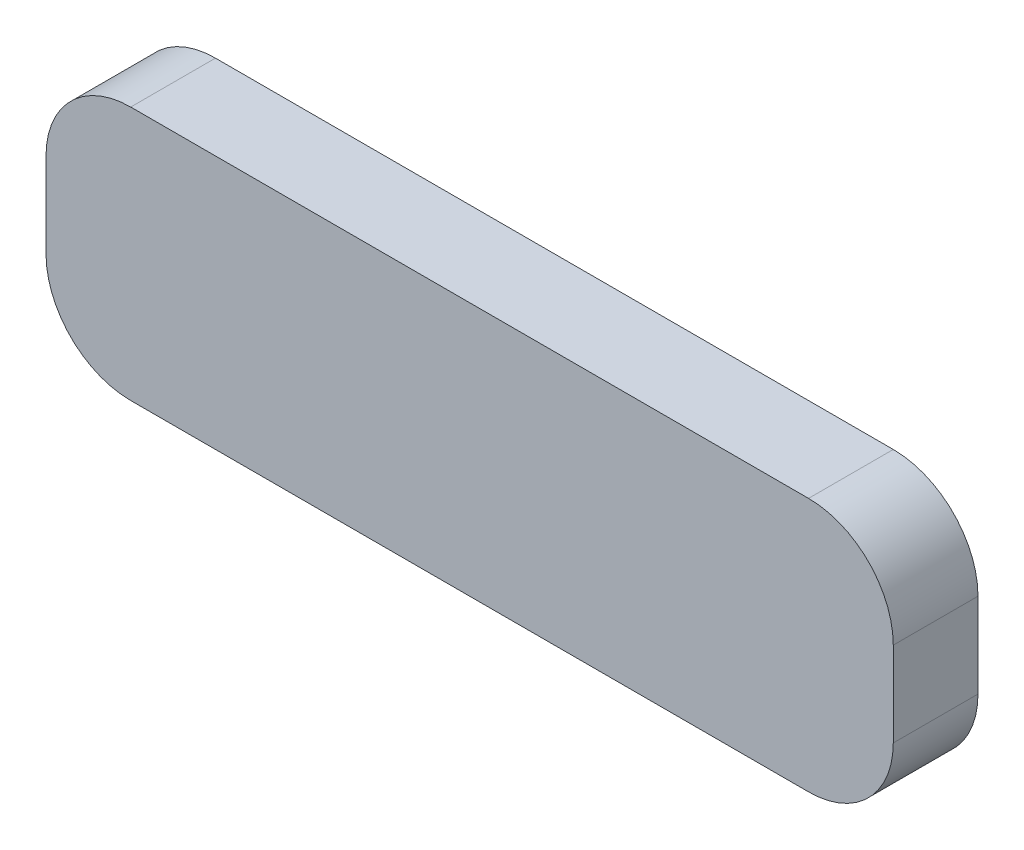
ISO-10303-21;
HEADER;
FILE_DESCRIPTION(('STEP AP214'),'2;1');
FILE_NAME('part.step','',(''),(''),'','','');
FILE_SCHEMA(('AUTOMOTIVE_DESIGN { 1 0 10303 214 1 1 1 1 }'));
ENDSEC;
DATA;
#1=APPLICATION_CONTEXT('core data for automotive mechanical design processes');
#2=APPLICATION_PROTOCOL_DEFINITION('international standard','automotive_design',2000,#1);
#3=PRODUCT_CONTEXT('',#1,'mechanical');
#4=PRODUCT('Part','Part','',(#3));
#5=PRODUCT_RELATED_PRODUCT_CATEGORY('part','',(#4));
#6=PRODUCT_DEFINITION_FORMATION('','',#4);
#7=PRODUCT_DEFINITION_CONTEXT('part definition',#1,'design');
#8=PRODUCT_DEFINITION('design','',#6,#7);
#9=PRODUCT_DEFINITION_SHAPE('','',#8);
#10=(LENGTH_UNIT() NAMED_UNIT(*) SI_UNIT(.MILLI.,.METRE.));
#11=(NAMED_UNIT(*) PLANE_ANGLE_UNIT() SI_UNIT($,.RADIAN.));
#12=(NAMED_UNIT(*) SI_UNIT($,.STERADIAN.) SOLID_ANGLE_UNIT());
#13=UNCERTAINTY_MEASURE_WITH_UNIT(LENGTH_MEASURE(1.E-05),#10,'distance_accuracy_value','');
#14=(GEOMETRIC_REPRESENTATION_CONTEXT(3) GLOBAL_UNCERTAINTY_ASSIGNED_CONTEXT((#13)) GLOBAL_UNIT_ASSIGNED_CONTEXT((#10,
#11,#12)) REPRESENTATION_CONTEXT('',''));
#15=CARTESIAN_POINT('',(0.,0.,0.));
#16=DIRECTION('',(0.,0.,1.));
#17=DIRECTION('',(1.,0.,0.));
#18=AXIS2_PLACEMENT_3D('',#15,#16,#17);
#19=CARTESIAN_POINT('',(10.,20.,10.));
#20=DIRECTION('',(0.,0.,-1.));
#21=DIRECTION('',(-1.,0.,0.));
#22=AXIS2_PLACEMENT_3D('',#19,#20,#21);
#23=CYLINDRICAL_SURFACE('',#22,10.);
#24=CARTESIAN_POINT('',(10.,20.,0.));
#25=DIRECTION('',(0.,0.,-1.));
#26=DIRECTION('',(-1.,0.,0.));
#27=AXIS2_PLACEMENT_3D('',#24,#25,#26);
#28=CIRCLE('',#27,10.);
#29=CARTESIAN_POINT('',(0.,19.9999999999999,0.));
#30=VERTEX_POINT('',#29);
#31=CARTESIAN_POINT('',(10.0000000000001,30.,0.));
#32=VERTEX_POINT('',#31);
#33=EDGE_CURVE('E134',#30,#32,#28,.T.);
#34=ORIENTED_EDGE('',*,*,#33,.F.);
#35=DIRECTION('',(0.,0.,-1.));
#36=VECTOR('',#35,1.);
#37=CARTESIAN_POINT('',(0.,19.9999999999999,10.));
#38=LINE('',#37,#36);
#39=CARTESIAN_POINT('',(0.,19.9999999999999,10.));
#40=VERTEX_POINT('',#39);
#41=EDGE_CURVE('E11',#40,#30,#38,.T.);
#42=ORIENTED_EDGE('',*,*,#41,.F.);
#43=CARTESIAN_POINT('',(10.,20.,10.));
#44=DIRECTION('',(0.,0.,-1.));
#45=DIRECTION('',(-1.,0.,0.));
#46=AXIS2_PLACEMENT_3D('',#43,#44,#45);
#47=CIRCLE('',#46,10.);
#48=CARTESIAN_POINT('',(10.0000000000001,30.,10.));
#49=VERTEX_POINT('',#48);
#50=EDGE_CURVE('E155',#40,#49,#47,.T.);
#51=ORIENTED_EDGE('',*,*,#50,.T.);
#52=DIRECTION('',(0.,0.,-1.));
#53=VECTOR('',#52,1.);
#54=CARTESIAN_POINT('',(10.0000000000001,30.,10.));
#55=LINE('',#54,#53);
#56=EDGE_CURVE('E45',#49,#32,#55,.T.);
#57=ORIENTED_EDGE('',*,*,#56,.T.);
#58=EDGE_LOOP('',(#34,#42,#51,#57));
#59=FACE_BOUND('',#58,.T.);
#60=ADVANCED_FACE('F39',(#59),#23,.T.);
#61=CARTESIAN_POINT('',(0.,10.0000000000001,10.));
#62=DIRECTION('',(-1.,0.,0.));
#63=DIRECTION('',(0.,0.,1.));
#64=AXIS2_PLACEMENT_3D('',#61,#62,#63);
#65=PLANE('',#64);
#66=DIRECTION('',(0.,1.,0.));
#67=VECTOR('',#66,1.);
#68=CARTESIAN_POINT('',(0.,10.0000000000001,0.));
#69=LINE('',#68,#67);
#70=CARTESIAN_POINT('',(0.,10.,0.));
#71=VERTEX_POINT('',#70);
#72=EDGE_CURVE('E147',#71,#30,#69,.T.);
#73=ORIENTED_EDGE('',*,*,#72,.F.);
#74=DIRECTION('',(0.,0.,-1.));
#75=VECTOR('',#74,1.);
#76=CARTESIAN_POINT('',(0.,10.,10.));
#77=LINE('',#76,#75);
#78=CARTESIAN_POINT('',(0.,10.,10.));
#79=VERTEX_POINT('',#78);
#80=EDGE_CURVE('E48',#79,#71,#77,.T.);
#81=ORIENTED_EDGE('',*,*,#80,.F.);
#82=DIRECTION('',(0.,1.,0.));
#83=VECTOR('',#82,1.);
#84=CARTESIAN_POINT('',(0.,10.0000000000001,10.));
#85=LINE('',#84,#83);
#86=EDGE_CURVE('E126',#79,#40,#85,.T.);
#87=ORIENTED_EDGE('',*,*,#86,.T.);
#88=ORIENTED_EDGE('',*,*,#41,.T.);
#89=EDGE_LOOP('',(#73,#81,#87,#88));
#90=FACE_BOUND('',#89,.T.);
#91=ADVANCED_FACE('F164',(#90),#65,.T.);
#92=CARTESIAN_POINT('',(10.,10.,10.));
#93=DIRECTION('',(0.,0.,-1.));
#94=DIRECTION('',(-1.,0.,0.));
#95=AXIS2_PLACEMENT_3D('',#92,#93,#94);
#96=CYLINDRICAL_SURFACE('',#95,10.);
#97=CARTESIAN_POINT('',(10.,10.,0.));
#98=DIRECTION('',(0.,0.,-1.));
#99=DIRECTION('',(-1.,0.,0.));
#100=AXIS2_PLACEMENT_3D('',#97,#98,#99);
#101=CIRCLE('',#100,10.);
#102=CARTESIAN_POINT('',(10.0000000000001,0.,0.));
#103=VERTEX_POINT('',#102);
#104=EDGE_CURVE('E111',#103,#71,#101,.T.);
#105=ORIENTED_EDGE('',*,*,#104,.F.);
#106=DIRECTION('',(0.,0.,-1.));
#107=VECTOR('',#106,1.);
#108=CARTESIAN_POINT('',(10.0000000000001,0.,10.));
#109=LINE('',#108,#107);
#110=CARTESIAN_POINT('',(10.0000000000001,0.,10.));
#111=VERTEX_POINT('',#110);
#112=EDGE_CURVE('E107',#111,#103,#109,.T.);
#113=ORIENTED_EDGE('',*,*,#112,.F.);
#114=CARTESIAN_POINT('',(10.,10.,10.));
#115=DIRECTION('',(0.,0.,-1.));
#116=DIRECTION('',(-1.,0.,0.));
#117=AXIS2_PLACEMENT_3D('',#114,#115,#116);
#118=CIRCLE('',#117,10.);
#119=EDGE_CURVE('E115',#111,#79,#118,.T.);
#120=ORIENTED_EDGE('',*,*,#119,.T.);
#121=ORIENTED_EDGE('',*,*,#80,.T.);
#122=EDGE_LOOP('',(#105,#113,#120,#121));
#123=FACE_BOUND('',#122,.T.);
#124=ADVANCED_FACE('F109',(#123),#96,.T.);
#125=CARTESIAN_POINT('',(10.0000000000001,0.,10.));
#126=DIRECTION('',(0.,1.,0.));
#127=DIRECTION('',(0.,0.,1.));
#128=AXIS2_PLACEMENT_3D('',#125,#126,#127);
#129=PLANE('',#128);
#130=DIRECTION('',(1.,0.,0.));
#131=VECTOR('',#130,1.);
#132=CARTESIAN_POINT('',(10.0000000000001,0.,0.));
#133=LINE('',#132,#131);
#134=CARTESIAN_POINT('',(90.,0.,0.));
#135=VERTEX_POINT('',#134);
#136=EDGE_CURVE('E150',#103,#135,#133,.T.);
#137=ORIENTED_EDGE('',*,*,#136,.T.);
#138=DIRECTION('',(0.,0.,-1.));
#139=VECTOR('',#138,1.);
#140=CARTESIAN_POINT('',(90.,0.,10.));
#141=LINE('',#140,#139);
#142=CARTESIAN_POINT('',(90.,0.,10.));
#143=VERTEX_POINT('',#142);
#144=EDGE_CURVE('E117',#143,#135,#141,.T.);
#145=ORIENTED_EDGE('',*,*,#144,.F.);
#146=DIRECTION('',(1.,0.,0.));
#147=VECTOR('',#146,1.);
#148=CARTESIAN_POINT('',(10.0000000000001,0.,10.));
#149=LINE('',#148,#147);
#150=EDGE_CURVE('E120',#111,#143,#149,.T.);
#151=ORIENTED_EDGE('',*,*,#150,.F.);
#152=ORIENTED_EDGE('',*,*,#112,.T.);
#153=EDGE_LOOP('',(#137,#145,#151,#152));
#154=FACE_BOUND('',#153,.T.);
#155=ADVANCED_FACE('F124',(#154),#129,.F.);
#156=CARTESIAN_POINT('',(90.,10.,10.));
#157=DIRECTION('',(0.,0.,-1.));
#158=DIRECTION('',(-1.,0.,0.));
#159=AXIS2_PLACEMENT_3D('',#156,#157,#158);
#160=CYLINDRICAL_SURFACE('',#159,10.);
#161=CARTESIAN_POINT('',(90.,10.,0.));
#162=DIRECTION('',(0.,0.,1.));
#163=DIRECTION('',(1.,0.,0.));
#164=AXIS2_PLACEMENT_3D('',#161,#162,#163);
#165=CIRCLE('',#164,10.);
#166=CARTESIAN_POINT('',(100.,10.,0.));
#167=VERTEX_POINT('',#166);
#168=EDGE_CURVE('E144',#135,#167,#165,.T.);
#169=ORIENTED_EDGE('',*,*,#168,.T.);
#170=DIRECTION('',(0.,0.,-1.));
#171=VECTOR('',#170,1.);
#172=CARTESIAN_POINT('',(100.,10.,10.));
#173=LINE('',#172,#171);
#174=CARTESIAN_POINT('',(100.,10.,10.));
#175=VERTEX_POINT('',#174);
#176=EDGE_CURVE('E156',#175,#167,#173,.T.);
#177=ORIENTED_EDGE('',*,*,#176,.F.);
#178=CARTESIAN_POINT('',(90.,10.,10.));
#179=DIRECTION('',(0.,0.,1.));
#180=DIRECTION('',(1.,0.,0.));
#181=AXIS2_PLACEMENT_3D('',#178,#179,#180);
#182=CIRCLE('',#181,10.);
#183=EDGE_CURVE('E122',#143,#175,#182,.T.);
#184=ORIENTED_EDGE('',*,*,#183,.F.);
#185=ORIENTED_EDGE('',*,*,#144,.T.);
#186=EDGE_LOOP('',(#169,#177,#184,#185));
#187=FACE_BOUND('',#186,.T.);
#188=ADVANCED_FACE('F180',(#187),#160,.T.);
#189=CARTESIAN_POINT('',(100.,10.,10.));
#190=DIRECTION('',(-1.,0.,0.));
#191=DIRECTION('',(0.,0.,1.));
#192=AXIS2_PLACEMENT_3D('',#189,#190,#191);
#193=PLANE('',#192);
#194=DIRECTION('',(0.,1.,0.));
#195=VECTOR('',#194,1.);
#196=CARTESIAN_POINT('',(100.,10.,0.));
#197=LINE('',#196,#195);
#198=CARTESIAN_POINT('',(100.,20.,0.));
#199=VERTEX_POINT('',#198);
#200=EDGE_CURVE('E142',#167,#199,#197,.T.);
#201=ORIENTED_EDGE('',*,*,#200,.T.);
#202=DIRECTION('',(0.,0.,-1.));
#203=VECTOR('',#202,1.);
#204=CARTESIAN_POINT('',(100.,20.,10.));
#205=LINE('',#204,#203);
#206=CARTESIAN_POINT('',(100.,20.,10.));
#207=VERTEX_POINT('',#206);
#208=EDGE_CURVE('E157',#207,#199,#205,.T.);
#209=ORIENTED_EDGE('',*,*,#208,.F.);
#210=DIRECTION('',(0.,1.,0.));
#211=VECTOR('',#210,1.);
#212=CARTESIAN_POINT('',(100.,10.,10.));
#213=LINE('',#212,#211);
#214=EDGE_CURVE('E260',#175,#207,#213,.T.);
#215=ORIENTED_EDGE('',*,*,#214,.F.);
#216=ORIENTED_EDGE('',*,*,#176,.T.);
#217=EDGE_LOOP('',(#201,#209,#215,#216));
#218=FACE_BOUND('',#217,.T.);
#219=ADVANCED_FACE('F182',(#218),#193,.F.);
#220=CARTESIAN_POINT('',(90.,20.,10.));
#221=DIRECTION('',(0.,0.,-1.));
#222=DIRECTION('',(-1.,0.,0.));
#223=AXIS2_PLACEMENT_3D('',#220,#221,#222);
#224=CYLINDRICAL_SURFACE('',#223,10.);
#225=CARTESIAN_POINT('',(90.,20.,0.));
#226=DIRECTION('',(0.,0.,-1.));
#227=DIRECTION('',(-1.,0.,0.));
#228=AXIS2_PLACEMENT_3D('',#225,#226,#227);
#229=CIRCLE('',#228,10.);
#230=CARTESIAN_POINT('',(90.,30.,0.));
#231=VERTEX_POINT('',#230);
#232=EDGE_CURVE('E138',#231,#199,#229,.T.);
#233=ORIENTED_EDGE('',*,*,#232,.F.);
#234=DIRECTION('',(0.,0.,-1.));
#235=VECTOR('',#234,1.);
#236=CARTESIAN_POINT('',(90.,30.,10.));
#237=LINE('',#236,#235);
#238=CARTESIAN_POINT('',(90.,30.,10.));
#239=VERTEX_POINT('',#238);
#240=EDGE_CURVE('E159',#239,#231,#237,.T.);
#241=ORIENTED_EDGE('',*,*,#240,.F.);
#242=CARTESIAN_POINT('',(90.,20.,10.));
#243=DIRECTION('',(0.,0.,-1.));
#244=DIRECTION('',(-1.,0.,0.));
#245=AXIS2_PLACEMENT_3D('',#242,#243,#244);
#246=CIRCLE('',#245,10.);
#247=EDGE_CURVE('E256',#239,#207,#246,.T.);
#248=ORIENTED_EDGE('',*,*,#247,.T.);
#249=ORIENTED_EDGE('',*,*,#208,.T.);
#250=EDGE_LOOP('',(#233,#241,#248,#249));
#251=FACE_BOUND('',#250,.T.);
#252=ADVANCED_FACE('F183',(#251),#224,.T.);
#253=CARTESIAN_POINT('',(10.0000000000001,30.,10.));
#254=DIRECTION('',(0.,1.,0.));
#255=DIRECTION('',(0.,0.,1.));
#256=AXIS2_PLACEMENT_3D('',#253,#254,#255);
#257=PLANE('',#256);
#258=DIRECTION('',(1.,0.,0.));
#259=VECTOR('',#258,1.);
#260=CARTESIAN_POINT('',(10.0000000000001,30.,0.));
#261=LINE('',#260,#259);
#262=EDGE_CURVE('E139',#32,#231,#261,.T.);
#263=ORIENTED_EDGE('',*,*,#262,.F.);
#264=ORIENTED_EDGE('',*,*,#56,.F.);
#265=DIRECTION('',(1.,0.,0.));
#266=VECTOR('',#265,1.);
#267=CARTESIAN_POINT('',(10.0000000000001,30.,10.));
#268=LINE('',#267,#266);
#269=EDGE_CURVE('E265',#49,#239,#268,.T.);
#270=ORIENTED_EDGE('',*,*,#269,.T.);
#271=ORIENTED_EDGE('',*,*,#240,.T.);
#272=EDGE_LOOP('',(#263,#264,#270,#271));
#273=FACE_BOUND('',#272,.T.);
#274=ADVANCED_FACE('F165',(#273),#257,.T.);
#275=CARTESIAN_POINT('',(10.,20.,10.));
#276=DIRECTION('',(0.,0.,-1.));
#277=DIRECTION('',(-1.,0.,0.));
#278=AXIS2_PLACEMENT_3D('',#275,#276,#277);
#279=PLANE('',#278);
#280=ORIENTED_EDGE('',*,*,#50,.F.);
#281=ORIENTED_EDGE('',*,*,#86,.F.);
#282=ORIENTED_EDGE('',*,*,#119,.F.);
#283=ORIENTED_EDGE('',*,*,#150,.T.);
#284=ORIENTED_EDGE('',*,*,#183,.T.);
#285=ORIENTED_EDGE('',*,*,#214,.T.);
#286=ORIENTED_EDGE('',*,*,#247,.F.);
#287=ORIENTED_EDGE('',*,*,#269,.F.);
#288=EDGE_LOOP('',(#280,#281,#282,#283,#284,#285,#286,#287));
#289=FACE_BOUND('',#288,.T.);
#290=ADVANCED_FACE('F130',(#289),#279,.F.);
#291=CARTESIAN_POINT('',(10.,20.,0.));
#292=DIRECTION('',(0.,0.,-1.));
#293=DIRECTION('',(-1.,0.,0.));
#294=AXIS2_PLACEMENT_3D('',#291,#292,#293);
#295=PLANE('',#294);
#296=ORIENTED_EDGE('',*,*,#33,.T.);
#297=ORIENTED_EDGE('',*,*,#262,.T.);
#298=ORIENTED_EDGE('',*,*,#232,.T.);
#299=ORIENTED_EDGE('',*,*,#200,.F.);
#300=ORIENTED_EDGE('',*,*,#168,.F.);
#301=ORIENTED_EDGE('',*,*,#136,.F.);
#302=ORIENTED_EDGE('',*,*,#104,.T.);
#303=ORIENTED_EDGE('',*,*,#72,.T.);
#304=EDGE_LOOP('',(#296,#297,#298,#299,#300,#301,#302,#303));
#305=FACE_BOUND('',#304,.T.);
#306=ADVANCED_FACE('F163',(#305),#295,.T.);
#307=CLOSED_SHELL('',(#60,#91,#124,#155,#188,#219,#252,#274,#290,#306));
#308=MANIFOLD_SOLID_BREP('B2',#307);
#309=ADVANCED_BREP_SHAPE_REPRESENTATION('',(#18,#308),#14);
#310=SHAPE_DEFINITION_REPRESENTATION(#9,#309);
ENDSEC;
END-ISO-10303-21;
